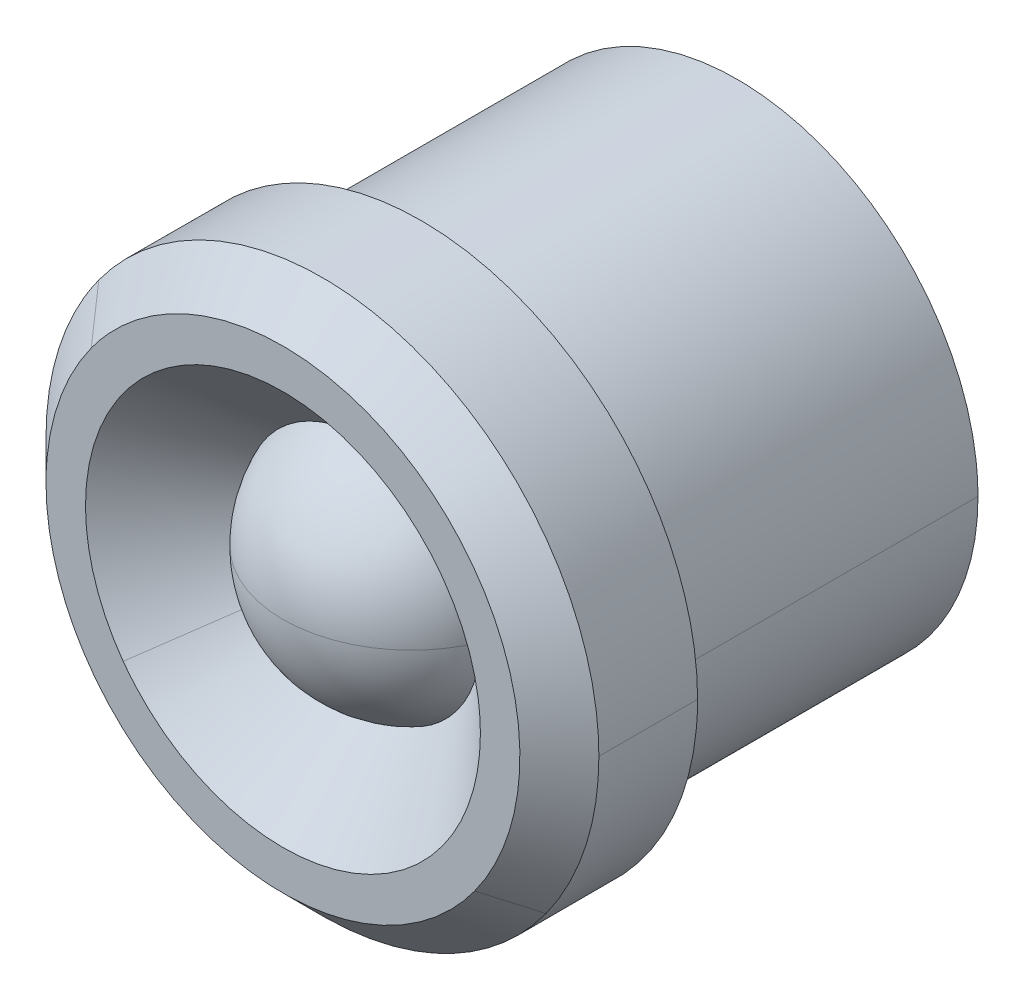
ISO-10303-21;
HEADER;
FILE_DESCRIPTION(('STEP AP214'),'2;1');
FILE_NAME('part.step','',(''),(''),'','','');
FILE_SCHEMA(('AUTOMOTIVE_DESIGN { 1 0 10303 214 1 1 1 1 }'));
ENDSEC;
DATA;
#1=APPLICATION_CONTEXT('core data for automotive mechanical design processes');
#2=APPLICATION_PROTOCOL_DEFINITION('international standard','automotive_design',2000,#1);
#3=PRODUCT_CONTEXT('',#1,'mechanical');
#4=PRODUCT('Part','Part','',(#3));
#5=PRODUCT_RELATED_PRODUCT_CATEGORY('part','',(#4));
#6=PRODUCT_DEFINITION_FORMATION('','',#4);
#7=PRODUCT_DEFINITION_CONTEXT('part definition',#1,'design');
#8=PRODUCT_DEFINITION('design','',#6,#7);
#9=PRODUCT_DEFINITION_SHAPE('','',#8);
#10=(LENGTH_UNIT() NAMED_UNIT(*) SI_UNIT(.MILLI.,.METRE.));
#11=(NAMED_UNIT(*) PLANE_ANGLE_UNIT() SI_UNIT($,.RADIAN.));
#12=(NAMED_UNIT(*) SI_UNIT($,.STERADIAN.) SOLID_ANGLE_UNIT());
#13=UNCERTAINTY_MEASURE_WITH_UNIT(LENGTH_MEASURE(1.E-05),#10,'distance_accuracy_value','');
#14=(GEOMETRIC_REPRESENTATION_CONTEXT(3) GLOBAL_UNCERTAINTY_ASSIGNED_CONTEXT((#13)) GLOBAL_UNIT_ASSIGNED_CONTEXT((#10,
#11,#12)) REPRESENTATION_CONTEXT('',''));
#15=CARTESIAN_POINT('',(0.,0.,0.));
#16=DIRECTION('',(0.,0.,1.));
#17=DIRECTION('',(1.,0.,0.));
#18=AXIS2_PLACEMENT_3D('',#15,#16,#17);
#19=CARTESIAN_POINT('',(0.,0.,3.5));
#20=CARTESIAN_POINT('',(0.,0.,3.5));
#21=CARTESIAN_POINT('',(0.,0.,3.5));
#22=CARTESIAN_POINT('',(0.,0.,3.5));
#23=CARTESIAN_POINT('',(0.,0.,3.5));
#24=CARTESIAN_POINT('',(-2.16666666666665,0.,3.50000000000003));
#25=CARTESIAN_POINT('',(-2.16666666666665,-2.1666666666667,3.50000000000003));
#26=CARTESIAN_POINT('',(0.,-2.1666666666667,3.5));
#27=CARTESIAN_POINT('',(2.16666666666674,-2.1666666666667,3.49999999999997));
#28=CARTESIAN_POINT('',(2.16666666666674,0.,3.49999999999996));
#29=CARTESIAN_POINT('',(-3.,0.,1.5));
#30=CARTESIAN_POINT('',(-3.,-3.00000000000002,1.5));
#31=CARTESIAN_POINT('',(0.,-3.,1.49999999999996));
#32=CARTESIAN_POINT('',(3.00000000000003,-3.00000000000002,1.49999999999991));
#33=CARTESIAN_POINT('',(3.,0.,1.49999999999991));
#34=(BOUNDED_SURFACE() B_SPLINE_SURFACE(2,2,((#19,#20,#21,#22,#23),(#24,#25,#26,#27,#28),(#29,
#30,#31,#32,#33)),.UNSPECIFIED.,.F.,.F.,.F.) B_SPLINE_SURFACE_WITH_KNOTS((3,3),(3,2,3),
(0.394791119699748,1.5707963267949),(-3.14159265358979,-1.5707963267949,0.),
.UNSPECIFIED.) GEOMETRIC_REPRESENTATION_ITEM() RATIONAL_B_SPLINE_SURFACE(((1.,0.707106781186548,
1.,0.707106781186548,1.),(0.83205029433784,0.588348405414549,0.83205029433784,0.588348405414549,
0.83205029433784),(1.,0.707106781186548,1.,0.707106781186548,1.))) REPRESENTATION_ITEM('') SURFACE());
#35=CARTESIAN_POINT('',(0.,0.,3.5));
#36=CARTESIAN_POINT('',(2.16666666666674,0.,3.49999999999996));
#37=CARTESIAN_POINT('',(3.,0.,1.5));
#38=(BOUNDED_CURVE() B_SPLINE_CURVE(2,(#35,#36,#37),.UNSPECIFIED.,.F.,
.F.) B_SPLINE_CURVE_WITH_KNOTS((3,3),(0.394791119699748,1.5707963267949),
.UNSPECIFIED.) CURVE() GEOMETRIC_REPRESENTATION_ITEM() RATIONAL_B_SPLINE_CURVE((1.,
0.83205029433784,1.)) REPRESENTATION_ITEM(''));
#39=CARTESIAN_POINT('',(0.,0.,3.5));
#40=VERTEX_POINT('',#39);
#41=CARTESIAN_POINT('',(3.,0.,1.5));
#42=VERTEX_POINT('',#41);
#43=EDGE_CURVE('E225',#40,#42,#38,.T.);
#44=CARTESIAN_POINT('',(0.,0.,3.5));
#45=CARTESIAN_POINT('',(-2.16666666666665,0.,3.50000000000003));
#46=CARTESIAN_POINT('',(-3.,0.,1.5));
#47=(BOUNDED_CURVE() B_SPLINE_CURVE(2,(#44,#45,#46),.UNSPECIFIED.,.F.,
.F.) B_SPLINE_CURVE_WITH_KNOTS((3,3),(0.394791119699748,1.5707963267949),
.UNSPECIFIED.) CURVE() GEOMETRIC_REPRESENTATION_ITEM() RATIONAL_B_SPLINE_CURVE((1.,
0.83205029433784,1.)) REPRESENTATION_ITEM(''));
#48=CARTESIAN_POINT('',(-3.,0.,1.5));
#49=VERTEX_POINT('',#48);
#50=EDGE_CURVE('E246',#40,#49,#47,.T.);
#51=CARTESIAN_POINT('',(-3.,0.,1.5));
#52=CARTESIAN_POINT('',(-3.,-0.974759088698727,1.5));
#53=CARTESIAN_POINT('',(-2.42705098312484,-1.76335575687743,1.5));
#54=(BOUNDED_CURVE() B_SPLINE_CURVE(2,(#51,#52,#53),.UNSPECIFIED.,.F.,
.F.) B_SPLINE_CURVE_WITH_KNOTS((3,3),(3.14159265358979,3.76991118430776),
.UNSPECIFIED.) CURVE() GEOMETRIC_REPRESENTATION_ITEM() RATIONAL_B_SPLINE_CURVE((1.,
0.951056516295152,1.)) REPRESENTATION_ITEM(''));
#55=CARTESIAN_POINT('',(-2.42705098312484,-1.76335575687743,1.5));
#56=VERTEX_POINT('',#55);
#57=EDGE_CURVE('E671',#49,#56,#54,.T.);
#58=CARTESIAN_POINT('',(-2.42705098312484,-1.76335575687743,1.5));
#59=CARTESIAN_POINT('',(-1.1458980337503,-3.52671151375484,1.5));
#60=CARTESIAN_POINT('',(0.92705098312485,-2.85316954888546,1.5));
#61=CARTESIAN_POINT('',(3.,-2.17962758401608,1.5));
#62=CARTESIAN_POINT('',(3.,0.,1.5));
#63=(BOUNDED_CURVE() B_SPLINE_CURVE(2,(#58,#59,#60,#61,#62),.UNSPECIFIED.,.F.,
.F.) B_SPLINE_CURVE_WITH_KNOTS((3,2,3),(3.76991118430776,5.02654824574367,6.28318530717959),
.UNSPECIFIED.) CURVE() GEOMETRIC_REPRESENTATION_ITEM() RATIONAL_B_SPLINE_CURVE((1.,
0.809016994374947,1.,0.809016994374948,1.)) REPRESENTATION_ITEM(''));
#64=EDGE_CURVE('E11',#56,#42,#63,.T.);
#65=ORIENTED_EDGE('',*,*,#43,.F.);
#66=ORIENTED_EDGE('',*,*,#50,.T.);
#67=ORIENTED_EDGE('',*,*,#57,.T.);
#68=ORIENTED_EDGE('',*,*,#64,.T.);
#69=EDGE_LOOP('',(#65,#66,#67,#68));
#70=FACE_BOUND('',#69,.T.);
#71=ADVANCED_FACE('F17',(#70),#34,.T.);
#72=CARTESIAN_POINT('',(-6.1,0.,0.));
#73=CARTESIAN_POINT('',(-6.1,-6.1,0.));
#74=CARTESIAN_POINT('',(0.,-6.1,0.));
#75=CARTESIAN_POINT('',(6.1,-6.1,0.));
#76=CARTESIAN_POINT('',(6.1,0.,0.));
#77=CARTESIAN_POINT('',(-6.1,0.,-8.));
#78=CARTESIAN_POINT('',(-6.1,-6.1,-8.00000000000004));
#79=CARTESIAN_POINT('',(0.,-6.1,-8.));
#80=CARTESIAN_POINT('',(6.1,-6.1,-8.00000000000004));
#81=CARTESIAN_POINT('',(6.1,0.,-8.));
#82=(BOUNDED_SURFACE() B_SPLINE_SURFACE(1,2,((#72,#73,#74,#75,#76),(#77,#78,#79,#80,#81)),
.UNSPECIFIED.,.F.,.F.,.F.) B_SPLINE_SURFACE_WITH_KNOTS((2,2),(3,2,3),(-0.65573770491804,
0.65573770491804),(-3.14159265358979,-1.5707963267949,0.),
.UNSPECIFIED.) GEOMETRIC_REPRESENTATION_ITEM() RATIONAL_B_SPLINE_SURFACE(((1.,0.707106781186548,
1.,0.707106781186548,1.),(1.,0.707106781186548,1.,0.707106781186548,1.))) REPRESENTATION_ITEM('') SURFACE());
#83=CARTESIAN_POINT('',(6.1,0.,0.));
#84=CARTESIAN_POINT('',(6.1,0.,-8.));
#85=(BOUNDED_CURVE() B_SPLINE_CURVE(1,(#83,#84),.UNSPECIFIED.,.F.,
.F.) B_SPLINE_CURVE_WITH_KNOTS((2,2),(-0.65573770491804,0.65573770491804),
.UNSPECIFIED.) CURVE() GEOMETRIC_REPRESENTATION_ITEM() RATIONAL_B_SPLINE_CURVE((1.,1.)) REPRESENTATION_ITEM(''));
#86=CARTESIAN_POINT('',(6.1,0.,0.));
#87=VERTEX_POINT('',#86);
#88=CARTESIAN_POINT('',(6.1,0.,-8.));
#89=VERTEX_POINT('',#88);
#90=EDGE_CURVE('E772',#87,#89,#85,.T.);
#91=CARTESIAN_POINT('',(6.1,0.,0.));
#92=CARTESIAN_POINT('',(6.1,-6.1,0.));
#93=CARTESIAN_POINT('',(0.,-6.1,0.));
#94=CARTESIAN_POINT('',(-6.1,-6.1,0.));
#95=CARTESIAN_POINT('',(-6.1,0.,0.));
#96=(BOUNDED_CURVE() B_SPLINE_CURVE(2,(#91,#92,#93,#94,#95),.UNSPECIFIED.,.F.,
.F.) B_SPLINE_CURVE_WITH_KNOTS((3,2,3),(-3.14159265358979,-1.57079632679489,0.),
.UNSPECIFIED.) CURVE() GEOMETRIC_REPRESENTATION_ITEM() RATIONAL_B_SPLINE_CURVE((1.,
0.707106781186547,1.,0.707106781186547,1.)) REPRESENTATION_ITEM(''));
#97=CARTESIAN_POINT('',(-6.1,0.,0.));
#98=VERTEX_POINT('',#97);
#99=EDGE_CURVE('E245',#87,#98,#96,.T.);
#100=CARTESIAN_POINT('',(-6.1,0.,0.));
#101=CARTESIAN_POINT('',(-6.1,0.,-8.));
#102=(BOUNDED_CURVE() B_SPLINE_CURVE(1,(#100,#101),.UNSPECIFIED.,.F.,
.F.) B_SPLINE_CURVE_WITH_KNOTS((2,2),(-0.65573770491804,0.65573770491804),
.UNSPECIFIED.) CURVE() GEOMETRIC_REPRESENTATION_ITEM() RATIONAL_B_SPLINE_CURVE((1.,1.)) REPRESENTATION_ITEM(''));
#103=CARTESIAN_POINT('',(-6.1,0.,-8.));
#104=VERTEX_POINT('',#103);
#105=EDGE_CURVE('E162',#98,#104,#102,.T.);
#106=CARTESIAN_POINT('',(6.1,0.,-8.));
#107=CARTESIAN_POINT('',(6.1,-6.1,-7.99999999999996));
#108=CARTESIAN_POINT('',(0.,-6.1,-8.));
#109=CARTESIAN_POINT('',(-6.1,-6.1,-7.99999999999996));
#110=CARTESIAN_POINT('',(-6.1,0.,-8.));
#111=(BOUNDED_CURVE() B_SPLINE_CURVE(2,(#106,#107,#108,#109,#110),.UNSPECIFIED.,.F.,
.F.) B_SPLINE_CURVE_WITH_KNOTS((3,2,3),(-3.14159265358979,-1.57079632679489,0.),
.UNSPECIFIED.) CURVE() GEOMETRIC_REPRESENTATION_ITEM() RATIONAL_B_SPLINE_CURVE((1.,
0.707106781186547,1.,0.707106781186547,1.)) REPRESENTATION_ITEM(''));
#112=EDGE_CURVE('E138',#89,#104,#111,.T.);
#113=ORIENTED_EDGE('',*,*,#90,.F.);
#114=ORIENTED_EDGE('',*,*,#99,.T.);
#115=ORIENTED_EDGE('',*,*,#105,.T.);
#116=ORIENTED_EDGE('',*,*,#112,.F.);
#117=EDGE_LOOP('',(#113,#114,#115,#116));
#118=FACE_BOUND('',#117,.T.);
#119=ADVANCED_FACE('F363',(#118),#82,.T.);
#120=CARTESIAN_POINT('',(-2.42705098312484,-1.76335575687743,1.5));
#121=CARTESIAN_POINT('',(-0.663695226247416,-4.19040674000226,1.5));
#122=CARTESIAN_POINT('',(1.76335575687741,-2.42705098312484,1.5));
#123=CARTESIAN_POINT('',(4.19040674000224,-0.663695226247424,1.5));
#124=CARTESIAN_POINT('',(2.42705098312483,1.76335575687741,1.5));
#125=CARTESIAN_POINT('',(-4.04508497187475,-2.9389262614624,3.5));
#126=CARTESIAN_POINT('',(-1.10615871041236,-6.98401123333716,3.50000000000003));
#127=CARTESIAN_POINT('',(2.93892626146238,-4.04508497187476,3.5));
#128=CARTESIAN_POINT('',(6.98401123333713,-1.10615871041237,3.50000000000003));
#129=CARTESIAN_POINT('',(4.04508497187474,2.93892626146238,3.5));
#130=(BOUNDED_SURFACE() B_SPLINE_SURFACE(1,2,((#120,#121,#122,#123,#124),(#125,#126,#127,#128,
#129)),.UNSPECIFIED.,.F.,.F.,.F.) B_SPLINE_SURFACE_WITH_KNOTS((2,2),(3,2,3),
(-0.0883883476483277,0.795495128834868),(-3.14159265358979,-1.5707963267949,0.),
.UNSPECIFIED.) GEOMETRIC_REPRESENTATION_ITEM() RATIONAL_B_SPLINE_SURFACE(((1.,0.707106781186548,
1.,0.707106781186548,1.),(1.,0.707106781186548,1.,0.707106781186548,1.))) REPRESENTATION_ITEM('') SURFACE());
#131=CARTESIAN_POINT('',(2.42705098312483,1.76335575687741,1.5));
#132=CARTESIAN_POINT('',(4.04508497187474,2.93892626146238,3.5));
#133=(BOUNDED_CURVE() B_SPLINE_CURVE(1,(#131,#132),.UNSPECIFIED.,.F.,
.F.) B_SPLINE_CURVE_WITH_KNOTS((2,2),(-0.0883883476483277,0.795495128834868),
.UNSPECIFIED.) CURVE() GEOMETRIC_REPRESENTATION_ITEM() RATIONAL_B_SPLINE_CURVE((1.,1.)) REPRESENTATION_ITEM(''));
#134=CARTESIAN_POINT('',(2.42705098312483,1.76335575687741,1.5));
#135=VERTEX_POINT('',#134);
#136=CARTESIAN_POINT('',(4.04508497187474,2.93892626146238,3.5));
#137=VERTEX_POINT('',#136);
#138=EDGE_CURVE('E819',#135,#137,#133,.T.);
#139=CARTESIAN_POINT('',(3.,0.,1.5));
#140=CARTESIAN_POINT('',(3.,0.974759088698719,1.5));
#141=CARTESIAN_POINT('',(2.42705098312483,1.76335575687741,1.5));
#142=(BOUNDED_CURVE() B_SPLINE_CURVE(2,(#139,#140,#141),.UNSPECIFIED.,.F.,
.F.) B_SPLINE_CURVE_WITH_KNOTS((3,3),(0.,0.63617036978739),
.UNSPECIFIED.) CURVE() GEOMETRIC_REPRESENTATION_ITEM() RATIONAL_B_SPLINE_CURVE((1.,
0.881378645886596,0.858840265006243)) REPRESENTATION_ITEM(''));
#143=EDGE_CURVE('E215',#42,#135,#142,.T.);
#144=CARTESIAN_POINT('',(-2.42705098312484,-1.76335575687743,1.5));
#145=CARTESIAN_POINT('',(-4.04508497187475,-2.9389262614624,3.5));
#146=(BOUNDED_CURVE() B_SPLINE_CURVE(1,(#144,#145),.UNSPECIFIED.,.F.,
.F.) B_SPLINE_CURVE_WITH_KNOTS((2,2),(-0.0883883476483277,0.795495128834868),
.UNSPECIFIED.) CURVE() GEOMETRIC_REPRESENTATION_ITEM() RATIONAL_B_SPLINE_CURVE((1.,1.)) REPRESENTATION_ITEM(''));
#147=CARTESIAN_POINT('',(-4.04508497187475,-2.9389262614624,3.5));
#148=VERTEX_POINT('',#147);
#149=EDGE_CURVE('E679',#56,#148,#146,.T.);
#150=CARTESIAN_POINT('',(5.,0.,3.5));
#151=CARTESIAN_POINT('',(5.,-3.6327126400268,3.49999999999997));
#152=CARTESIAN_POINT('',(1.54508497187475,-4.75528258147576,3.5));
#153=CARTESIAN_POINT('',(-1.90983005625051,-5.87785252292473,3.49999999999996));
#154=CARTESIAN_POINT('',(-4.04508497187475,-2.9389262614624,3.5));
#155=(BOUNDED_CURVE() B_SPLINE_CURVE(2,(#150,#151,#152,#153,#154),.UNSPECIFIED.,.F.,
.F.) B_SPLINE_CURVE_WITH_KNOTS((3,2,3),(0.,1.25663706143591,2.51327412287182),
.UNSPECIFIED.) CURVE() GEOMETRIC_REPRESENTATION_ITEM() RATIONAL_B_SPLINE_CURVE((1.,
0.809016994374949,1.,0.809016994374948,1.)) REPRESENTATION_ITEM(''));
#156=CARTESIAN_POINT('',(5.,0.,3.5));
#157=VERTEX_POINT('',#156);
#158=EDGE_CURVE('E172',#157,#148,#155,.T.);
#159=CARTESIAN_POINT('',(4.04508497187474,2.93892626146238,3.5));
#160=CARTESIAN_POINT('',(5.00000000000001,1.62459848116454,3.50000000000002));
#161=CARTESIAN_POINT('',(5.,0.,3.5));
#162=(BOUNDED_CURVE() B_SPLINE_CURVE(2,(#159,#160,#161),.UNSPECIFIED.,.F.,
.F.) B_SPLINE_CURVE_WITH_KNOTS((3,3),(5.65486677646162,6.28318530717958),
.UNSPECIFIED.) CURVE() GEOMETRIC_REPRESENTATION_ITEM() RATIONAL_B_SPLINE_CURVE((0.904508497187474,
0.904508497187473,1.)) REPRESENTATION_ITEM(''));
#163=EDGE_CURVE('E45',#137,#157,#162,.T.);
#164=ORIENTED_EDGE('',*,*,#138,.F.);
#165=ORIENTED_EDGE('',*,*,#143,.F.);
#166=ORIENTED_EDGE('',*,*,#64,.F.);
#167=ORIENTED_EDGE('',*,*,#149,.T.);
#168=ORIENTED_EDGE('',*,*,#158,.F.);
#169=ORIENTED_EDGE('',*,*,#163,.F.);
#170=EDGE_LOOP('',(#164,#165,#166,#167,#168,#169));
#171=FACE_BOUND('',#170,.T.);
#172=ADVANCED_FACE('F349',(#171),#130,.T.);
#173=CARTESIAN_POINT('',(4.8541019662497,-3.52671151375486,3.5));
#174=CARTESIAN_POINT('',(8.38081348000455,1.32739045249484,3.50000000000003));
#175=CARTESIAN_POINT('',(3.52671151375485,4.85410196624969,3.5));
#176=CARTESIAN_POINT('',(-1.32739045249485,8.38081348000455,3.50000000000003));
#177=CARTESIAN_POINT('',(-4.8541019662497,3.52671151375485,3.5));
#178=CARTESIAN_POINT('',(5.66311896062467,-4.11449676604736,2.5));
#179=CARTESIAN_POINT('',(9.77761572667202,1.54862219457732,2.5));
#180=CARTESIAN_POINT('',(4.11449676604735,5.66311896062467,2.5));
#181=CARTESIAN_POINT('',(-1.54862219457733,9.77761572667202,2.5));
#182=CARTESIAN_POINT('',(-5.66311896062468,4.11449676604734,2.5));
#183=(BOUNDED_SURFACE() B_SPLINE_SURFACE(1,2,((#173,#174,#175,#176,#177),(#178,#179,#180,#181,
#182)),.UNSPECIFIED.,.F.,.F.,.F.) B_SPLINE_SURFACE_WITH_KNOTS((2,2),(3,2,3),
(-0.0204958487300558,0.184462638570399),(-3.14159265358979,-1.5707963267949,0.),
.UNSPECIFIED.) GEOMETRIC_REPRESENTATION_ITEM() RATIONAL_B_SPLINE_SURFACE(((1.,0.707106781186548,
1.,0.707106781186548,1.),(1.,0.707106781186548,1.,0.707106781186548,1.))) REPRESENTATION_ITEM('') SURFACE());
#184=CARTESIAN_POINT('',(-4.8541019662497,3.52671151375485,3.5));
#185=CARTESIAN_POINT('',(-5.66311896062468,4.11449676604734,2.5));
#186=(BOUNDED_CURVE() B_SPLINE_CURVE(1,(#184,#185),.UNSPECIFIED.,.F.,
.F.) B_SPLINE_CURVE_WITH_KNOTS((2,2),(-0.0204958487300558,0.184462638570399),
.UNSPECIFIED.) CURVE() GEOMETRIC_REPRESENTATION_ITEM() RATIONAL_B_SPLINE_CURVE((1.,1.)) REPRESENTATION_ITEM(''));
#187=CARTESIAN_POINT('',(-4.8541019662497,3.52671151375485,3.5));
#188=VERTEX_POINT('',#187);
#189=CARTESIAN_POINT('',(-5.66311896062468,4.11449676604734,2.5));
#190=VERTEX_POINT('',#189);
#191=EDGE_CURVE('E182',#188,#190,#186,.T.);
#192=CARTESIAN_POINT('',(4.8541019662497,-3.52671151375486,3.5));
#193=CARTESIAN_POINT('',(7.41640786499874,0.,3.5));
#194=CARTESIAN_POINT('',(4.85410196624969,3.52671151375483,3.5));
#195=CARTESIAN_POINT('',(2.29179606750064,7.05342302750968,3.5));
#196=CARTESIAN_POINT('',(-1.85410196624968,5.70633909777092,3.5));
#197=CARTESIAN_POINT('',(-3.70820393249936,5.10390485011224,3.5));
#198=CARTESIAN_POINT('',(-4.8541019662497,3.52671151375485,3.5));
#199=(BOUNDED_CURVE() B_SPLINE_CURVE(2,(#192,#193,#194,#195,#196,#197,#198),.UNSPECIFIED.,.F.,
.F.) B_SPLINE_CURVE_WITH_KNOTS((3,2,2,3),(-0.62831853071796,0.628318530717957,1.88495559215388,
2.51327412287184),
.UNSPECIFIED.) CURVE() GEOMETRIC_REPRESENTATION_ITEM() RATIONAL_B_SPLINE_CURVE((1.,
0.809016994374947,1.,0.809016994374947,1.,0.904508497187474,0.904508497187474)) REPRESENTATION_ITEM(''));
#200=CARTESIAN_POINT('',(4.8541019662497,-3.52671151375486,3.5));
#201=VERTEX_POINT('',#200);
#202=EDGE_CURVE('E137',#201,#188,#199,.T.);
#203=CARTESIAN_POINT('',(4.8541019662497,-3.52671151375486,3.5));
#204=CARTESIAN_POINT('',(5.66311896062467,-4.11449676604736,2.5));
#205=(BOUNDED_CURVE() B_SPLINE_CURVE(1,(#203,#204),.UNSPECIFIED.,.F.,
.F.) B_SPLINE_CURVE_WITH_KNOTS((2,2),(-0.0204958487300558,0.184462638570399),
.UNSPECIFIED.) CURVE() GEOMETRIC_REPRESENTATION_ITEM() RATIONAL_B_SPLINE_CURVE((1.,1.)) REPRESENTATION_ITEM(''));
#206=CARTESIAN_POINT('',(5.66311896062467,-4.11449676604736,2.5));
#207=VERTEX_POINT('',#206);
#208=EDGE_CURVE('E236',#201,#207,#205,.T.);
#209=CARTESIAN_POINT('',(7.,0.,2.50000000000005));
#210=CARTESIAN_POINT('',(7.,-2.27443787363035,2.50000000000002));
#211=CARTESIAN_POINT('',(5.66311896062467,-4.11449676604736,2.5));
#212=(BOUNDED_CURVE() B_SPLINE_CURVE(2,(#209,#210,#211),.UNSPECIFIED.,.F.,
.F.) B_SPLINE_CURVE_WITH_KNOTS((3,3),(3.1415926535898,3.76991118430776),
.UNSPECIFIED.) CURVE() GEOMETRIC_REPRESENTATION_ITEM() RATIONAL_B_SPLINE_CURVE((1.,
0.951056516295158,1.)) REPRESENTATION_ITEM(''));
#213=CARTESIAN_POINT('',(7.,0.,2.50000000000005));
#214=VERTEX_POINT('',#213);
#215=EDGE_CURVE('E31',#214,#207,#212,.T.);
#216=CARTESIAN_POINT('',(-5.66311896062468,4.11449676604734,2.5));
#217=CARTESIAN_POINT('',(-3.56667814646101,7.00000000000001,2.49999999999995));
#218=CARTESIAN_POINT('',(0.,7.,2.49999999999995));
#219=CARTESIAN_POINT('',(7.00000000000001,7.00000000000001,2.49999999999995));
#220=CARTESIAN_POINT('',(7.,0.,2.50000000000005));
#221=(BOUNDED_CURVE() B_SPLINE_CURVE(2,(#216,#217,#218,#219,#220),.UNSPECIFIED.,.F.,
.F.) B_SPLINE_CURVE_WITH_KNOTS((3,2,3),(0.636170369787394,1.5707963267949,3.1415926535898),
.UNSPECIFIED.) CURVE() GEOMETRIC_REPRESENTATION_ITEM() RATIONAL_B_SPLINE_CURVE((0.858840265006243,
0.825728135299952,1.,0.707106781186548,1.)) REPRESENTATION_ITEM(''));
#222=EDGE_CURVE('E181',#190,#214,#221,.T.);
#223=ORIENTED_EDGE('',*,*,#191,.F.);
#224=ORIENTED_EDGE('',*,*,#202,.F.);
#225=ORIENTED_EDGE('',*,*,#208,.T.);
#226=ORIENTED_EDGE('',*,*,#215,.F.);
#227=ORIENTED_EDGE('',*,*,#222,.F.);
#228=EDGE_LOOP('',(#223,#224,#225,#226,#227));
#229=FACE_BOUND('',#228,.T.);
#230=ADVANCED_FACE('F343',(#229),#183,.T.);
#231=CARTESIAN_POINT('',(7.,0.,0.));
#232=CARTESIAN_POINT('',(7.00000000000001,-7.00000000000001,0.));
#233=CARTESIAN_POINT('',(0.,-7.,0.));
#234=CARTESIAN_POINT('',(-7.00000000000001,-7.00000000000001,0.));
#235=CARTESIAN_POINT('',(-7.,0.,0.));
#236=CARTESIAN_POINT('',(7.,0.,2.50000000000005));
#237=CARTESIAN_POINT('',(7.00000000000001,-7.00000000000001,2.50000000000005));
#238=CARTESIAN_POINT('',(0.,-7.,2.50000000000005));
#239=CARTESIAN_POINT('',(-7.00000000000001,-7.00000000000001,2.50000000000005));
#240=CARTESIAN_POINT('',(-7.,0.,2.50000000000005));
#241=(BOUNDED_SURFACE() B_SPLINE_SURFACE(1,2,((#231,#232,#233,#234,#235),(#236,#237,#238,#239,
#240)),.UNSPECIFIED.,.F.,.F.,.F.) B_SPLINE_SURFACE_WITH_KNOTS((2,2),(3,2,3),(-0.178571428571436,
0.178571428571429),(-3.14159265358979,-1.5707963267949,0.),
.UNSPECIFIED.) GEOMETRIC_REPRESENTATION_ITEM() RATIONAL_B_SPLINE_SURFACE(((1.,0.707106781186548,
1.,0.707106781186548,1.),(1.,0.707106781186548,1.,0.707106781186548,1.))) REPRESENTATION_ITEM('') SURFACE());
#242=CARTESIAN_POINT('',(-7.,0.,0.));
#243=CARTESIAN_POINT('',(-7.,0.,2.5));
#244=(BOUNDED_CURVE() B_SPLINE_CURVE(1,(#242,#243),.UNSPECIFIED.,.F.,
.F.) B_SPLINE_CURVE_WITH_KNOTS((2,2),(-0.178571428571436,0.178571428571429),
.UNSPECIFIED.) CURVE() GEOMETRIC_REPRESENTATION_ITEM() RATIONAL_B_SPLINE_CURVE((1.,1.)) REPRESENTATION_ITEM(''));
#245=CARTESIAN_POINT('',(-7.,0.,0.));
#246=VERTEX_POINT('',#245);
#247=CARTESIAN_POINT('',(-7.,0.,2.5));
#248=VERTEX_POINT('',#247);
#249=EDGE_CURVE('E262',#246,#248,#244,.T.);
#250=CARTESIAN_POINT('',(-7.,0.,0.));
#251=CARTESIAN_POINT('',(-7.00000000000001,-7.00000000000001,0.));
#252=CARTESIAN_POINT('',(0.,-7.,0.));
#253=CARTESIAN_POINT('',(7.00000000000001,-7.00000000000001,0.));
#254=CARTESIAN_POINT('',(7.,0.,0.));
#255=(BOUNDED_CURVE() B_SPLINE_CURVE(2,(#250,#251,#252,#253,#254),.UNSPECIFIED.,.F.,
.F.) B_SPLINE_CURVE_WITH_KNOTS((3,2,3),(-3.14159265358979,-1.5707963267949,0.),
.UNSPECIFIED.) CURVE() GEOMETRIC_REPRESENTATION_ITEM() RATIONAL_B_SPLINE_CURVE((1.,
0.707106781186548,1.,0.707106781186548,1.)) REPRESENTATION_ITEM(''));
#256=CARTESIAN_POINT('',(7.,0.,0.));
#257=VERTEX_POINT('',#256);
#258=EDGE_CURVE('E237',#246,#257,#255,.T.);
#259=CARTESIAN_POINT('',(7.,0.,0.));
#260=CARTESIAN_POINT('',(7.,0.,2.50000000000005));
#261=(BOUNDED_CURVE() B_SPLINE_CURVE(1,(#259,#260),.UNSPECIFIED.,.F.,
.F.) B_SPLINE_CURVE_WITH_KNOTS((2,2),(-0.178571428571436,0.178571428571429),
.UNSPECIFIED.) CURVE() GEOMETRIC_REPRESENTATION_ITEM() RATIONAL_B_SPLINE_CURVE((1.,1.)) REPRESENTATION_ITEM(''));
#262=EDGE_CURVE('E156',#257,#214,#261,.T.);
#263=CARTESIAN_POINT('',(5.66311896062467,-4.11449676604736,2.5));
#264=CARTESIAN_POINT('',(2.67376207875072,-8.22899353209464,2.50000000000006));
#265=CARTESIAN_POINT('',(-2.16311896062464,-6.65739561406608,2.50000000000005));
#266=CARTESIAN_POINT('',(-7.,-5.08579769603752,2.50000000000004));
#267=CARTESIAN_POINT('',(-7.,0.,2.5));
#268=(BOUNDED_CURVE() B_SPLINE_CURVE(2,(#263,#264,#265,#266,#267),.UNSPECIFIED.,.F.,
.F.) B_SPLINE_CURVE_WITH_KNOTS((3,2,3),(3.76991118430776,5.02654824574368,6.28318530717959),
.UNSPECIFIED.) CURVE() GEOMETRIC_REPRESENTATION_ITEM() RATIONAL_B_SPLINE_CURVE((1.,
0.809016994374948,1.,0.809016994374947,1.)) REPRESENTATION_ITEM(''));
#269=EDGE_CURVE('E694',#207,#248,#268,.T.);
#270=ORIENTED_EDGE('',*,*,#249,.F.);
#271=ORIENTED_EDGE('',*,*,#258,.T.);
#272=ORIENTED_EDGE('',*,*,#262,.T.);
#273=ORIENTED_EDGE('',*,*,#215,.T.);
#274=ORIENTED_EDGE('',*,*,#269,.T.);
#275=EDGE_LOOP('',(#270,#271,#272,#273,#274));
#276=FACE_BOUND('',#275,.T.);
#277=ADVANCED_FACE('F348',(#276),#241,.T.);
#278=CARTESIAN_POINT('',(3.,0.,0.));
#279=CARTESIAN_POINT('',(3.,-3.,0.));
#280=CARTESIAN_POINT('',(0.,-3.,0.));
#281=CARTESIAN_POINT('',(-3.,-3.,0.));
#282=CARTESIAN_POINT('',(-3.,0.,0.));
#283=CARTESIAN_POINT('',(3.,0.,-8.));
#284=CARTESIAN_POINT('',(3.,-3.,-8.00000000000002));
#285=CARTESIAN_POINT('',(0.,-3.,-8.));
#286=CARTESIAN_POINT('',(-3.,-3.,-8.00000000000002));
#287=CARTESIAN_POINT('',(-3.,0.,-8.));
#288=(BOUNDED_SURFACE() B_SPLINE_SURFACE(1,2,((#278,#279,#280,#281,#282),(#283,#284,#285,#286,
#287)),.UNSPECIFIED.,.F.,.F.,.F.) B_SPLINE_SURFACE_WITH_KNOTS((2,2),(3,2,3),(-1.33333333333333,
1.33333333333334),(-3.14159265358979,-1.5707963267949,0.),
.UNSPECIFIED.) GEOMETRIC_REPRESENTATION_ITEM() RATIONAL_B_SPLINE_SURFACE(((1.,0.707106781186548,
1.,0.707106781186548,1.),(1.,0.707106781186548,1.,0.707106781186548,1.))) REPRESENTATION_ITEM('') SURFACE());
#289=CARTESIAN_POINT('',(-3.,0.,0.));
#290=CARTESIAN_POINT('',(-3.,0.,-8.));
#291=(BOUNDED_CURVE() B_SPLINE_CURVE(1,(#289,#290),.UNSPECIFIED.,.F.,
.F.) B_SPLINE_CURVE_WITH_KNOTS((2,2),(-1.33333333333333,1.33333333333334),
.UNSPECIFIED.) CURVE() GEOMETRIC_REPRESENTATION_ITEM() RATIONAL_B_SPLINE_CURVE((1.,1.)) REPRESENTATION_ITEM(''));
#292=CARTESIAN_POINT('',(-3.,0.,0.));
#293=VERTEX_POINT('',#292);
#294=CARTESIAN_POINT('',(-3.,0.,-8.));
#295=VERTEX_POINT('',#294);
#296=EDGE_CURVE('E130',#293,#295,#291,.T.);
#297=CARTESIAN_POINT('',(-3.,0.,0.));
#298=CARTESIAN_POINT('',(-3.,-3.,0.));
#299=CARTESIAN_POINT('',(0.,-3.,0.));
#300=CARTESIAN_POINT('',(3.,-3.,0.));
#301=CARTESIAN_POINT('',(3.,0.,0.));
#302=(BOUNDED_CURVE() B_SPLINE_CURVE(2,(#297,#298,#299,#300,#301),.UNSPECIFIED.,.F.,
.F.) B_SPLINE_CURVE_WITH_KNOTS((3,2,3),(-3.14159265358979,-1.5707963267949,0.),
.UNSPECIFIED.) CURVE() GEOMETRIC_REPRESENTATION_ITEM() RATIONAL_B_SPLINE_CURVE((1.,
0.707106781186548,1.,0.707106781186548,1.)) REPRESENTATION_ITEM(''));
#303=CARTESIAN_POINT('',(3.,0.,0.));
#304=VERTEX_POINT('',#303);
#305=EDGE_CURVE('E200',#293,#304,#302,.T.);
#306=CARTESIAN_POINT('',(3.,0.,0.));
#307=CARTESIAN_POINT('',(3.,0.,-8.));
#308=(BOUNDED_CURVE() B_SPLINE_CURVE(1,(#306,#307),.UNSPECIFIED.,.F.,
.F.) B_SPLINE_CURVE_WITH_KNOTS((2,2),(-1.33333333333333,1.33333333333334),
.UNSPECIFIED.) CURVE() GEOMETRIC_REPRESENTATION_ITEM() RATIONAL_B_SPLINE_CURVE((1.,1.)) REPRESENTATION_ITEM(''));
#309=CARTESIAN_POINT('',(3.,0.,-8.));
#310=VERTEX_POINT('',#309);
#311=EDGE_CURVE('E133',#304,#310,#308,.T.);
#312=CARTESIAN_POINT('',(3.,0.,-8.));
#313=CARTESIAN_POINT('',(3.,-3.,-8.00000000000002));
#314=CARTESIAN_POINT('',(0.,-3.,-8.));
#315=CARTESIAN_POINT('',(-3.,-3.,-8.00000000000002));
#316=CARTESIAN_POINT('',(-3.,0.,-8.));
#317=(BOUNDED_CURVE() B_SPLINE_CURVE(2,(#312,#313,#314,#315,#316),.UNSPECIFIED.,.F.,
.F.) B_SPLINE_CURVE_WITH_KNOTS((3,2,3),(0.,1.57079632679489,3.14159265358979),
.UNSPECIFIED.) CURVE() GEOMETRIC_REPRESENTATION_ITEM() RATIONAL_B_SPLINE_CURVE((1.,
0.707106781186548,1.,0.707106781186548,1.)) REPRESENTATION_ITEM(''));
#318=EDGE_CURVE('E126',#310,#295,#317,.T.);
#319=ORIENTED_EDGE('',*,*,#296,.F.);
#320=ORIENTED_EDGE('',*,*,#305,.T.);
#321=ORIENTED_EDGE('',*,*,#311,.T.);
#322=ORIENTED_EDGE('',*,*,#318,.T.);
#323=EDGE_LOOP('',(#319,#320,#321,#322));
#324=FACE_BOUND('',#323,.T.);
#325=ADVANCED_FACE('F128',(#324),#288,.T.);
#326=CARTESIAN_POINT('',(7.01,-7.01,0.));
#327=CARTESIAN_POINT('',(7.01,7.01,0.));
#328=CARTESIAN_POINT('',(-7.01,-7.01,0.));
#329=CARTESIAN_POINT('',(-7.01,7.01,0.));
#330=(BOUNDED_SURFACE() B_SPLINE_SURFACE(1,1,((#326,#327),(#328,#329)),.UNSPECIFIED.,.F.,.F.,
.F.) B_SPLINE_SURFACE_WITH_KNOTS((2,2),(2,2),(-0.701,0.701),(-0.701,0.701),
.UNSPECIFIED.) GEOMETRIC_REPRESENTATION_ITEM() RATIONAL_B_SPLINE_SURFACE(((1.,1.),(1.,1.))) REPRESENTATION_ITEM('') SURFACE());
#331=CARTESIAN_POINT('',(-6.1,0.,0.));
#332=CARTESIAN_POINT('',(-6.1,6.1,0.));
#333=CARTESIAN_POINT('',(0.,6.1,0.));
#334=CARTESIAN_POINT('',(6.1,6.1,0.));
#335=CARTESIAN_POINT('',(6.1,0.,0.));
#336=(BOUNDED_CURVE() B_SPLINE_CURVE(2,(#331,#332,#333,#334,#335),.UNSPECIFIED.,.F.,
.F.) B_SPLINE_CURVE_WITH_KNOTS((3,2,3),(0.,1.5707963267949,3.1415926535898),
.UNSPECIFIED.) CURVE() GEOMETRIC_REPRESENTATION_ITEM() RATIONAL_B_SPLINE_CURVE((1.,
0.707106781186547,1.,0.707106781186548,1.)) REPRESENTATION_ITEM(''));
#337=EDGE_CURVE('E793',#98,#87,#336,.T.);
#338=CARTESIAN_POINT('',(7.,0.,0.));
#339=CARTESIAN_POINT('',(7.00000000000001,7.00000000000001,0.));
#340=CARTESIAN_POINT('',(0.,7.,0.));
#341=CARTESIAN_POINT('',(-7.00000000000001,7.00000000000001,0.));
#342=CARTESIAN_POINT('',(-7.,0.,0.));
#343=(BOUNDED_CURVE() B_SPLINE_CURVE(2,(#338,#339,#340,#341,#342),.UNSPECIFIED.,.F.,
.F.) B_SPLINE_CURVE_WITH_KNOTS((3,2,3),(0.,1.5707963267949,3.14159265358979),
.UNSPECIFIED.) CURVE() GEOMETRIC_REPRESENTATION_ITEM() RATIONAL_B_SPLINE_CURVE((1.,
0.707106781186548,1.,0.707106781186548,1.)) REPRESENTATION_ITEM(''));
#344=EDGE_CURVE('E235',#257,#246,#343,.T.);
#345=ORIENTED_EDGE('',*,*,#99,.F.);
#346=ORIENTED_EDGE('',*,*,#337,.F.);
#347=EDGE_LOOP('',(#345,#346));
#348=FACE_BOUND('',#347,.T.);
#349=ORIENTED_EDGE('',*,*,#258,.F.);
#350=ORIENTED_EDGE('',*,*,#344,.F.);
#351=EDGE_LOOP('',(#349,#350));
#352=FACE_BOUND('',#351,.T.);
#353=ADVANCED_FACE('F324',(#348,#352),#330,.T.);
#354=CARTESIAN_POINT('',(-6.01,-7.06342302750968,3.5));
#355=CARTESIAN_POINT('',(-6.01,7.06342302750968,3.5));
#356=CARTESIAN_POINT('',(7.42640786499874,-7.06342302750968,3.5));
#357=CARTESIAN_POINT('',(7.42640786499874,7.06342302750968,3.5));
#358=(BOUNDED_SURFACE() B_SPLINE_SURFACE(1,1,((#354,#355),(#356,#357)),.UNSPECIFIED.,.F.,.F.,
.F.) B_SPLINE_SURFACE_WITH_KNOTS((2,2),(2,2),(-0.601,0.742640786499874),(-0.706342302750968,
0.706342302750968),
.UNSPECIFIED.) GEOMETRIC_REPRESENTATION_ITEM() RATIONAL_B_SPLINE_SURFACE(((1.,1.),(1.,1.))) REPRESENTATION_ITEM('') SURFACE());
#359=CARTESIAN_POINT('',(-4.04508497187475,-2.9389262614624,3.5));
#360=CARTESIAN_POINT('',(-6.18033988749895,0.,3.5));
#361=CARTESIAN_POINT('',(-4.04508497187474,2.93892626146236,3.5));
#362=CARTESIAN_POINT('',(-1.90983005625054,5.87785252292473,3.50000000000004));
#363=CARTESIAN_POINT('',(1.54508497187473,4.75528258147577,3.5));
#364=CARTESIAN_POINT('',(3.09016994374947,4.2532540417602,3.50000000000001));
#365=CARTESIAN_POINT('',(4.04508497187474,2.93892626146238,3.5));
#366=(BOUNDED_CURVE() B_SPLINE_CURVE(2,(#359,#360,#361,#362,#363,#364,#365),.UNSPECIFIED.,.F.,
.F.) B_SPLINE_CURVE_WITH_KNOTS((3,2,2,3),(2.51327412287182,3.76991118430774,5.02654824574366,
5.65486677646162),
.UNSPECIFIED.) CURVE() GEOMETRIC_REPRESENTATION_ITEM() RATIONAL_B_SPLINE_CURVE((1.,
0.809016994374947,1.,0.809016994374946,1.,0.904508497187474,0.904508497187474)) REPRESENTATION_ITEM(''));
#367=EDGE_CURVE('E684',#148,#137,#366,.T.);
#368=CARTESIAN_POINT('',(-6.,0.,3.5));
#369=CARTESIAN_POINT('',(-6.,-4.35925516803216,3.5));
#370=CARTESIAN_POINT('',(-1.85410196624969,-5.70633909777092,3.5));
#371=CARTESIAN_POINT('',(2.29179606750062,-7.05342302750969,3.5));
#372=CARTESIAN_POINT('',(4.8541019662497,-3.52671151375486,3.5));
#373=(BOUNDED_CURVE() B_SPLINE_CURVE(2,(#368,#369,#370,#371,#372),.UNSPECIFIED.,.F.,
.F.) B_SPLINE_CURVE_WITH_KNOTS((3,2,3),(-3.14159265358979,-1.88495559215388,-0.62831853071796),
.UNSPECIFIED.) CURVE() GEOMETRIC_REPRESENTATION_ITEM() RATIONAL_B_SPLINE_CURVE((1.,
0.809016994374947,1.,0.809016994374949,1.)) REPRESENTATION_ITEM(''));
#374=CARTESIAN_POINT('',(-6.,0.,3.5));
#375=VERTEX_POINT('',#374);
#376=EDGE_CURVE('E226',#375,#201,#373,.T.);
#377=CARTESIAN_POINT('',(-4.8541019662497,3.52671151375485,3.5));
#378=CARTESIAN_POINT('',(-5.99999999999999,1.94951817739744,3.5));
#379=CARTESIAN_POINT('',(-6.,0.,3.5));
#380=(BOUNDED_CURVE() B_SPLINE_CURVE(2,(#377,#378,#379),.UNSPECIFIED.,.F.,
.F.) B_SPLINE_CURVE_WITH_KNOTS((3,3),(2.51327412287184,3.14159265358979),
.UNSPECIFIED.) CURVE() GEOMETRIC_REPRESENTATION_ITEM() RATIONAL_B_SPLINE_CURVE((0.904508497187474,
0.904508497187474,1.)) REPRESENTATION_ITEM(''));
#381=EDGE_CURVE('E192',#188,#375,#380,.T.);
#382=ORIENTED_EDGE('',*,*,#158,.T.);
#383=ORIENTED_EDGE('',*,*,#367,.T.);
#384=ORIENTED_EDGE('',*,*,#163,.T.);
#385=EDGE_LOOP('',(#382,#383,#384));
#386=FACE_BOUND('',#385,.T.);
#387=ORIENTED_EDGE('',*,*,#376,.T.);
#388=ORIENTED_EDGE('',*,*,#202,.T.);
#389=ORIENTED_EDGE('',*,*,#381,.T.);
#390=EDGE_LOOP('',(#387,#388,#389));
#391=FACE_BOUND('',#390,.T.);
#392=ADVANCED_FACE('F312',(#386,#391),#358,.T.);
#393=CARTESIAN_POINT('',(6.11,-6.11,-8.));
#394=CARTESIAN_POINT('',(6.11,6.11,-8.));
#395=CARTESIAN_POINT('',(-6.11,-6.11,-8.));
#396=CARTESIAN_POINT('',(-6.11,6.11,-8.));
#397=(BOUNDED_SURFACE() B_SPLINE_SURFACE(1,1,((#393,#394),(#395,#396)),.UNSPECIFIED.,.F.,.F.,
.F.) B_SPLINE_SURFACE_WITH_KNOTS((2,2),(2,2),(-0.611,0.611),(-0.611,0.611),
.UNSPECIFIED.) GEOMETRIC_REPRESENTATION_ITEM() RATIONAL_B_SPLINE_SURFACE(((1.,1.),(1.,1.))) REPRESENTATION_ITEM('') SURFACE());
#398=CARTESIAN_POINT('',(-3.,0.,-8.));
#399=CARTESIAN_POINT('',(-3.,3.,-7.99999999999998));
#400=CARTESIAN_POINT('',(0.,3.,-8.));
#401=CARTESIAN_POINT('',(3.,3.,-7.99999999999998));
#402=CARTESIAN_POINT('',(3.,0.,-8.));
#403=(BOUNDED_CURVE() B_SPLINE_CURVE(2,(#398,#399,#400,#401,#402),.UNSPECIFIED.,.F.,
.F.) B_SPLINE_CURVE_WITH_KNOTS((3,2,3),(-3.1415926535898,-1.5707963267949,0.),
.UNSPECIFIED.) CURVE() GEOMETRIC_REPRESENTATION_ITEM() RATIONAL_B_SPLINE_CURVE((1.,
0.707106781186548,1.,0.707106781186548,1.)) REPRESENTATION_ITEM(''));
#404=EDGE_CURVE('E140',#295,#310,#403,.T.);
#405=CARTESIAN_POINT('',(-6.1,0.,-8.));
#406=CARTESIAN_POINT('',(-6.1,6.1,-8.00000000000005));
#407=CARTESIAN_POINT('',(0.,6.1,-8.));
#408=CARTESIAN_POINT('',(6.1,6.1,-8.00000000000004));
#409=CARTESIAN_POINT('',(6.1,0.,-8.));
#410=(BOUNDED_CURVE() B_SPLINE_CURVE(2,(#405,#406,#407,#408,#409),.UNSPECIFIED.,.F.,
.F.) B_SPLINE_CURVE_WITH_KNOTS((3,2,3),(0.,1.5707963267949,3.1415926535898),
.UNSPECIFIED.) CURVE() GEOMETRIC_REPRESENTATION_ITEM() RATIONAL_B_SPLINE_CURVE((1.,
0.707106781186547,1.,0.707106781186548,1.)) REPRESENTATION_ITEM(''));
#411=EDGE_CURVE('E763',#104,#89,#410,.T.);
#412=ORIENTED_EDGE('',*,*,#404,.F.);
#413=ORIENTED_EDGE('',*,*,#318,.F.);
#414=EDGE_LOOP('',(#412,#413));
#415=FACE_BOUND('',#414,.T.);
#416=ORIENTED_EDGE('',*,*,#112,.T.);
#417=ORIENTED_EDGE('',*,*,#411,.T.);
#418=EDGE_LOOP('',(#416,#417));
#419=FACE_BOUND('',#418,.T.);
#420=ADVANCED_FACE('F141',(#415,#419),#397,.T.);
#421=CARTESIAN_POINT('',(3.01,-3.01,0.));
#422=CARTESIAN_POINT('',(3.01,3.01,0.));
#423=CARTESIAN_POINT('',(-3.01,-3.01,0.));
#424=CARTESIAN_POINT('',(-3.01,3.01,0.));
#425=(BOUNDED_SURFACE() B_SPLINE_SURFACE(1,1,((#421,#422),(#423,#424)),.UNSPECIFIED.,.F.,.F.,
.F.) B_SPLINE_SURFACE_WITH_KNOTS((2,2),(2,2),(-0.301,0.301),(-0.301,0.301),
.UNSPECIFIED.) GEOMETRIC_REPRESENTATION_ITEM() RATIONAL_B_SPLINE_SURFACE(((1.,1.),(1.,1.))) REPRESENTATION_ITEM('') SURFACE());
#426=CARTESIAN_POINT('',(3.,0.,0.));
#427=CARTESIAN_POINT('',(3.,3.,0.));
#428=CARTESIAN_POINT('',(0.,3.,0.));
#429=CARTESIAN_POINT('',(-3.,3.,0.));
#430=CARTESIAN_POINT('',(-3.,0.,0.));
#431=(BOUNDED_CURVE() B_SPLINE_CURVE(2,(#426,#427,#428,#429,#430),.UNSPECIFIED.,.F.,
.F.) B_SPLINE_CURVE_WITH_KNOTS((3,2,3),(0.,1.5707963267949,3.14159265358979),
.UNSPECIFIED.) CURVE() GEOMETRIC_REPRESENTATION_ITEM() RATIONAL_B_SPLINE_CURVE((1.,
0.707106781186548,1.,0.707106781186548,1.)) REPRESENTATION_ITEM(''));
#432=EDGE_CURVE('E148',#304,#293,#431,.T.);
#433=ORIENTED_EDGE('',*,*,#305,.F.);
#434=ORIENTED_EDGE('',*,*,#432,.F.);
#435=EDGE_LOOP('',(#433,#434));
#436=FACE_BOUND('',#435,.T.);
#437=ADVANCED_FACE('F311',(#436),#425,.T.);
#438=CARTESIAN_POINT('',(-3.,0.,0.));
#439=CARTESIAN_POINT('',(-3.,3.,0.));
#440=CARTESIAN_POINT('',(0.,3.,0.));
#441=CARTESIAN_POINT('',(3.,3.,0.));
#442=CARTESIAN_POINT('',(3.,0.,0.));
#443=CARTESIAN_POINT('',(-3.,0.,-8.));
#444=CARTESIAN_POINT('',(-3.,3.,-8.00000000000002));
#445=CARTESIAN_POINT('',(0.,3.,-8.));
#446=CARTESIAN_POINT('',(3.,3.,-8.00000000000002));
#447=CARTESIAN_POINT('',(3.,0.,-8.));
#448=(BOUNDED_SURFACE() B_SPLINE_SURFACE(1,2,((#438,#439,#440,#441,#442),(#443,#444,#445,#446,
#447)),.UNSPECIFIED.,.F.,.F.,.F.) B_SPLINE_SURFACE_WITH_KNOTS((2,2),(3,2,3),(-1.33333333333333,
1.33333333333334),(0.,1.5707963267949,3.14159265358979),
.UNSPECIFIED.) GEOMETRIC_REPRESENTATION_ITEM() RATIONAL_B_SPLINE_SURFACE(((1.,0.707106781186548,
1.,0.707106781186548,1.),(1.,0.707106781186548,1.,0.707106781186548,1.))) REPRESENTATION_ITEM('') SURFACE());
#449=ORIENTED_EDGE('',*,*,#432,.T.);
#450=ORIENTED_EDGE('',*,*,#296,.T.);
#451=ORIENTED_EDGE('',*,*,#404,.T.);
#452=ORIENTED_EDGE('',*,*,#311,.F.);
#453=EDGE_LOOP('',(#449,#450,#451,#452));
#454=FACE_BOUND('',#453,.T.);
#455=ADVANCED_FACE('F146',(#454),#448,.T.);
#456=CARTESIAN_POINT('',(-7.,0.,0.));
#457=CARTESIAN_POINT('',(-7.00000000000001,7.00000000000001,0.));
#458=CARTESIAN_POINT('',(0.,7.,0.));
#459=CARTESIAN_POINT('',(7.00000000000001,7.00000000000001,0.));
#460=CARTESIAN_POINT('',(7.,0.,0.));
#461=CARTESIAN_POINT('',(-7.,0.,2.50000000000005));
#462=CARTESIAN_POINT('',(-7.00000000000001,7.00000000000001,2.50000000000005));
#463=CARTESIAN_POINT('',(0.,7.,2.50000000000005));
#464=CARTESIAN_POINT('',(7.00000000000001,7.00000000000001,2.50000000000005));
#465=CARTESIAN_POINT('',(7.,0.,2.50000000000005));
#466=(BOUNDED_SURFACE() B_SPLINE_SURFACE(1,2,((#456,#457,#458,#459,#460),(#461,#462,#463,#464,
#465)),.UNSPECIFIED.,.F.,.F.,.F.) B_SPLINE_SURFACE_WITH_KNOTS((2,2),(3,2,3),(-0.178571428571436,
0.178571428571429),(0.,1.5707963267949,3.14159265358979),
.UNSPECIFIED.) GEOMETRIC_REPRESENTATION_ITEM() RATIONAL_B_SPLINE_SURFACE(((1.,0.707106781186548,
1.,0.707106781186548,1.),(1.,0.707106781186548,1.,0.707106781186548,1.))) REPRESENTATION_ITEM('') SURFACE());
#467=CARTESIAN_POINT('',(-7.,0.,2.5));
#468=CARTESIAN_POINT('',(-7.,2.27443787363034,2.49999999999998));
#469=CARTESIAN_POINT('',(-5.66311896062468,4.11449676604734,2.5));
#470=(BOUNDED_CURVE() B_SPLINE_CURVE(2,(#467,#468,#469),.UNSPECIFIED.,.F.,
.F.) B_SPLINE_CURVE_WITH_KNOTS((3,3),(0.,0.636170369787394),
.UNSPECIFIED.) CURVE() GEOMETRIC_REPRESENTATION_ITEM() RATIONAL_B_SPLINE_CURVE((1.,
0.881378645886596,0.858840265006243)) REPRESENTATION_ITEM(''));
#471=EDGE_CURVE('E191',#248,#190,#470,.T.);
#472=ORIENTED_EDGE('',*,*,#344,.T.);
#473=ORIENTED_EDGE('',*,*,#249,.T.);
#474=ORIENTED_EDGE('',*,*,#471,.T.);
#475=ORIENTED_EDGE('',*,*,#222,.T.);
#476=ORIENTED_EDGE('',*,*,#262,.F.);
#477=EDGE_LOOP('',(#472,#473,#474,#475,#476));
#478=FACE_BOUND('',#477,.T.);
#479=ADVANCED_FACE('F416',(#478),#466,.T.);
#480=CARTESIAN_POINT('',(-4.8541019662497,3.52671151375485,3.5));
#481=CARTESIAN_POINT('',(-8.38081348000456,-1.32739045249485,3.50000000000003));
#482=CARTESIAN_POINT('',(-3.52671151375486,-4.85410196624971,3.5));
#483=CARTESIAN_POINT('',(1.32739045249484,-8.38081348000456,3.50000000000003));
#484=CARTESIAN_POINT('',(4.8541019662497,-3.52671151375486,3.5));
#485=CARTESIAN_POINT('',(-5.66311896062468,4.11449676604734,2.5));
#486=CARTESIAN_POINT('',(-9.77761572667202,-1.54862219457733,2.5));
#487=CARTESIAN_POINT('',(-4.11449676604735,-5.66311896062468,2.5));
#488=CARTESIAN_POINT('',(1.54862219457732,-9.77761572667203,2.5));
#489=CARTESIAN_POINT('',(5.66311896062467,-4.11449676604736,2.5));
#490=(BOUNDED_SURFACE() B_SPLINE_SURFACE(1,2,((#480,#481,#482,#483,#484),(#485,#486,#487,#488,
#489)),.UNSPECIFIED.,.F.,.F.,.F.) B_SPLINE_SURFACE_WITH_KNOTS((2,2),(3,2,3),
(-0.0204958487300558,0.184462638570399),(0.,1.5707963267949,3.14159265358979),
.UNSPECIFIED.) GEOMETRIC_REPRESENTATION_ITEM() RATIONAL_B_SPLINE_SURFACE(((1.,0.707106781186548,
1.,0.707106781186548,1.),(1.,0.707106781186548,1.,0.707106781186548,1.))) REPRESENTATION_ITEM('') SURFACE());
#491=ORIENTED_EDGE('',*,*,#381,.F.);
#492=ORIENTED_EDGE('',*,*,#191,.T.);
#493=ORIENTED_EDGE('',*,*,#471,.F.);
#494=ORIENTED_EDGE('',*,*,#269,.F.);
#495=ORIENTED_EDGE('',*,*,#208,.F.);
#496=ORIENTED_EDGE('',*,*,#376,.F.);
#497=EDGE_LOOP('',(#491,#492,#493,#494,#495,#496));
#498=FACE_BOUND('',#497,.T.);
#499=ADVANCED_FACE('F296',(#498),#490,.T.);
#500=CARTESIAN_POINT('',(2.42705098312483,1.76335575687741,1.5));
#501=CARTESIAN_POINT('',(0.663695226247405,4.19040674000224,1.49999999999999));
#502=CARTESIAN_POINT('',(-1.76335575687743,2.42705098312482,1.5));
#503=CARTESIAN_POINT('',(-4.19040674000226,0.663695226247398,1.49999999999999));
#504=CARTESIAN_POINT('',(-2.42705098312484,-1.76335575687743,1.5));
#505=CARTESIAN_POINT('',(4.04508497187474,2.93892626146238,3.5));
#506=CARTESIAN_POINT('',(1.10615871041235,6.98401123333713,3.50000000000003));
#507=CARTESIAN_POINT('',(-2.93892626146239,4.04508497187474,3.5));
#508=CARTESIAN_POINT('',(-6.98401123333714,1.10615871041235,3.50000000000003));
#509=CARTESIAN_POINT('',(-4.04508497187475,-2.9389262614624,3.5));
#510=(BOUNDED_SURFACE() B_SPLINE_SURFACE(1,2,((#500,#501,#502,#503,#504),(#505,#506,#507,#508,
#509)),.UNSPECIFIED.,.F.,.F.,.F.) B_SPLINE_SURFACE_WITH_KNOTS((2,2),(3,2,3),
(-0.0883883476483277,0.795495128834868),(0.,1.5707963267949,3.14159265358979),
.UNSPECIFIED.) GEOMETRIC_REPRESENTATION_ITEM() RATIONAL_B_SPLINE_SURFACE(((1.,0.707106781186548,
1.,0.707106781186548,1.),(1.,0.707106781186548,1.,0.707106781186548,1.))) REPRESENTATION_ITEM('') SURFACE());
#511=CARTESIAN_POINT('',(2.42705098312483,1.76335575687741,1.5));
#512=CARTESIAN_POINT('',(1.52857634848329,3.00000000000001,1.5));
#513=CARTESIAN_POINT('',(0.,3.,1.5));
#514=CARTESIAN_POINT('',(-3.,3.,1.5));
#515=CARTESIAN_POINT('',(-3.,0.,1.5));
#516=(BOUNDED_CURVE() B_SPLINE_CURVE(2,(#511,#512,#513,#514,#515),.UNSPECIFIED.,.F.,
.F.) B_SPLINE_CURVE_WITH_KNOTS((3,2,3),(0.63617036978739,1.5707963267949,3.14159265358979),
.UNSPECIFIED.) CURVE() GEOMETRIC_REPRESENTATION_ITEM() RATIONAL_B_SPLINE_CURVE((0.858840265006243,
0.825728135299952,1.,0.707106781186548,1.)) REPRESENTATION_ITEM(''));
#517=EDGE_CURVE('E224',#135,#49,#516,.T.);
#518=ORIENTED_EDGE('',*,*,#517,.F.);
#519=ORIENTED_EDGE('',*,*,#138,.T.);
#520=ORIENTED_EDGE('',*,*,#367,.F.);
#521=ORIENTED_EDGE('',*,*,#149,.F.);
#522=ORIENTED_EDGE('',*,*,#57,.F.);
#523=EDGE_LOOP('',(#518,#519,#520,#521,#522));
#524=FACE_BOUND('',#523,.T.);
#525=ADVANCED_FACE('F290',(#524),#510,.T.);
#526=CARTESIAN_POINT('',(6.1,0.,0.));
#527=CARTESIAN_POINT('',(6.1,6.1,0.));
#528=CARTESIAN_POINT('',(0.,6.1,0.));
#529=CARTESIAN_POINT('',(-6.1,6.1,0.));
#530=CARTESIAN_POINT('',(-6.1,0.,0.));
#531=CARTESIAN_POINT('',(6.1,0.,-8.));
#532=CARTESIAN_POINT('',(6.1,6.1,-8.00000000000004));
#533=CARTESIAN_POINT('',(0.,6.1,-8.));
#534=CARTESIAN_POINT('',(-6.1,6.1,-8.00000000000004));
#535=CARTESIAN_POINT('',(-6.1,0.,-8.));
#536=(BOUNDED_SURFACE() B_SPLINE_SURFACE(1,2,((#526,#527,#528,#529,#530),(#531,#532,#533,#534,
#535)),.UNSPECIFIED.,.F.,.F.,.F.) B_SPLINE_SURFACE_WITH_KNOTS((2,2),(3,2,3),(-0.65573770491804,
0.65573770491804),(0.,1.5707963267949,3.14159265358979),
.UNSPECIFIED.) GEOMETRIC_REPRESENTATION_ITEM() RATIONAL_B_SPLINE_SURFACE(((1.,0.707106781186548,
1.,0.707106781186548,1.),(1.,0.707106781186548,1.,0.707106781186548,1.))) REPRESENTATION_ITEM('') SURFACE());
#537=ORIENTED_EDGE('',*,*,#337,.T.);
#538=ORIENTED_EDGE('',*,*,#90,.T.);
#539=ORIENTED_EDGE('',*,*,#411,.F.);
#540=ORIENTED_EDGE('',*,*,#105,.F.);
#541=EDGE_LOOP('',(#537,#538,#539,#540));
#542=FACE_BOUND('',#541,.T.);
#543=ADVANCED_FACE('F295',(#542),#536,.T.);
#544=CARTESIAN_POINT('',(0.,0.,3.5));
#545=CARTESIAN_POINT('',(0.,0.,3.5));
#546=CARTESIAN_POINT('',(0.,0.,3.5));
#547=CARTESIAN_POINT('',(0.,0.,3.5));
#548=CARTESIAN_POINT('',(0.,0.,3.5));
#549=CARTESIAN_POINT('',(2.16666666666674,0.,3.49999999999996));
#550=CARTESIAN_POINT('',(2.16666666666674,2.1666666666667,3.49999999999996));
#551=CARTESIAN_POINT('',(0.,2.1666666666667,3.49999999999999));
#552=CARTESIAN_POINT('',(-2.16666666666665,2.1666666666667,3.50000000000002));
#553=CARTESIAN_POINT('',(-2.16666666666665,0.,3.50000000000003));
#554=CARTESIAN_POINT('',(3.,0.,1.49999999999991));
#555=CARTESIAN_POINT('',(3.00000000000003,3.00000000000002,1.49999999999991));
#556=CARTESIAN_POINT('',(0.,3.,1.49999999999995));
#557=CARTESIAN_POINT('',(-3.,3.00000000000002,1.5));
#558=CARTESIAN_POINT('',(-3.,0.,1.5));
#559=(BOUNDED_SURFACE() B_SPLINE_SURFACE(2,2,((#544,#545,#546,#547,#548),(#549,#550,#551,#552,
#553),(#554,#555,#556,#557,#558)),.UNSPECIFIED.,.F.,.F.,.F.) B_SPLINE_SURFACE_WITH_KNOTS((3,3),
(3,2,3),(0.394791119699748,1.5707963267949),(0.,1.5707963267949,3.14159265358979),
.UNSPECIFIED.) GEOMETRIC_REPRESENTATION_ITEM() RATIONAL_B_SPLINE_SURFACE(((1.,0.707106781186548,
1.,0.707106781186548,1.),(0.83205029433784,0.588348405414549,0.83205029433784,0.588348405414549,
0.83205029433784),(1.,0.707106781186548,1.,0.707106781186548,1.))) REPRESENTATION_ITEM('') SURFACE());
#560=ORIENTED_EDGE('',*,*,#50,.F.);
#561=ORIENTED_EDGE('',*,*,#43,.T.);
#562=ORIENTED_EDGE('',*,*,#143,.T.);
#563=ORIENTED_EDGE('',*,*,#517,.T.);
#564=EDGE_LOOP('',(#560,#561,#562,#563));
#565=FACE_BOUND('',#564,.T.);
#566=ADVANCED_FACE('F19',(#565),#559,.T.);
#567=CLOSED_SHELL('',(#71,#119,#172,#230,#277,#325,#353,#392,#420,#437,#455,#479,#499,#525,#543,#566));
#568=MANIFOLD_SOLID_BREP('B1',#567);
#569=ADVANCED_BREP_SHAPE_REPRESENTATION('',(#18,#568),#14);
#570=SHAPE_DEFINITION_REPRESENTATION(#9,#569);
ENDSEC;
END-ISO-10303-21;
